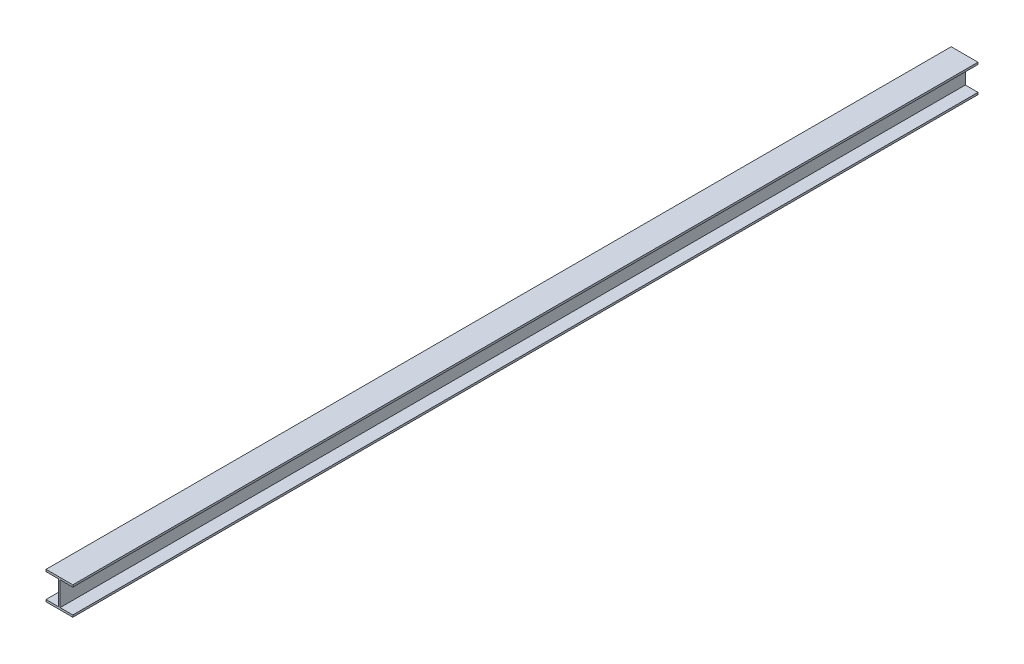
ISO-10303-21;
HEADER;
FILE_DESCRIPTION(('STEP AP214'),'2;1');
FILE_NAME('part.step','',(''),(''),'','','');
FILE_SCHEMA(('AUTOMOTIVE_DESIGN { 1 0 10303 214 1 1 1 1 }'));
ENDSEC;
DATA;
#1=APPLICATION_CONTEXT('core data for automotive mechanical design processes');
#2=APPLICATION_PROTOCOL_DEFINITION('international standard','automotive_design',2000,#1);
#3=PRODUCT_CONTEXT('',#1,'mechanical');
#4=PRODUCT('Part','Part','',(#3));
#5=PRODUCT_RELATED_PRODUCT_CATEGORY('part','',(#4));
#6=PRODUCT_DEFINITION_FORMATION('','',#4);
#7=PRODUCT_DEFINITION_CONTEXT('part definition',#1,'design');
#8=PRODUCT_DEFINITION('design','',#6,#7);
#9=PRODUCT_DEFINITION_SHAPE('','',#8);
#10=(LENGTH_UNIT() NAMED_UNIT(*) SI_UNIT(.MILLI.,.METRE.));
#11=(NAMED_UNIT(*) PLANE_ANGLE_UNIT() SI_UNIT($,.RADIAN.));
#12=(NAMED_UNIT(*) SI_UNIT($,.STERADIAN.) SOLID_ANGLE_UNIT());
#13=UNCERTAINTY_MEASURE_WITH_UNIT(LENGTH_MEASURE(1.E-05),#10,'distance_accuracy_value','');
#14=(GEOMETRIC_REPRESENTATION_CONTEXT(3) GLOBAL_UNCERTAINTY_ASSIGNED_CONTEXT((#13)) GLOBAL_UNIT_ASSIGNED_CONTEXT((#10,
#11,#12)) REPRESENTATION_CONTEXT('',''));
#15=CARTESIAN_POINT('',(0.,0.,0.));
#16=DIRECTION('',(0.,0.,1.));
#17=DIRECTION('',(1.,0.,0.));
#18=AXIS2_PLACEMENT_3D('',#15,#16,#17);
#19=CARTESIAN_POINT('',(154.432,-162.052240532958,5214.4));
#20=DIRECTION('',(0.,1.,0.));
#21=DIRECTION('',(-1.,0.,0.));
#22=AXIS2_PLACEMENT_3D('',#19,#20,#21);
#23=PLANE('',#22);
#24=DIRECTION('',(-1.,0.,0.));
#25=VECTOR('',#24,1.);
#26=CARTESIAN_POINT('',(154.432,-162.052240532958,2759.6));
#27=LINE('',#26,#25);
#28=CARTESIAN_POINT('',(154.432,-162.052240532958,2759.6));
#29=VERTEX_POINT('',#28);
#30=CARTESIAN_POINT('',(0.,-162.052240532958,2759.6));
#31=VERTEX_POINT('',#30);
#32=EDGE_CURVE('E11',#29,#31,#27,.T.);
#33=ORIENTED_EDGE('',*,*,#32,.F.);
#34=DIRECTION('',(0.,0.,-1.));
#35=VECTOR('',#34,1.);
#36=CARTESIAN_POINT('',(154.432,-162.052240532958,5214.4));
#37=LINE('',#36,#35);
#38=CARTESIAN_POINT('',(154.432,-162.052240532958,5214.4));
#39=VERTEX_POINT('',#38);
#40=EDGE_CURVE('E178',#39,#29,#37,.T.);
#41=ORIENTED_EDGE('',*,*,#40,.F.);
#42=DIRECTION('',(1.,0.,0.));
#43=VECTOR('',#42,1.);
#44=CARTESIAN_POINT('',(154.432,-162.052240532958,5214.4));
#45=LINE('',#44,#43);
#46=CARTESIAN_POINT('',(0.,-162.052240532958,5214.4));
#47=VERTEX_POINT('',#46);
#48=EDGE_CURVE('E235',#47,#39,#45,.T.);
#49=ORIENTED_EDGE('',*,*,#48,.F.);
#50=DIRECTION('',(0.,0.,-1.));
#51=VECTOR('',#50,1.);
#52=CARTESIAN_POINT('',(0.,-162.052240532958,5214.4));
#53=LINE('',#52,#51);
#54=EDGE_CURVE('E173',#47,#31,#53,.T.);
#55=ORIENTED_EDGE('',*,*,#54,.T.);
#56=EDGE_LOOP('',(#33,#41,#49,#55));
#57=FACE_BOUND('',#56,.T.);
#58=ADVANCED_FACE('F36',(#57),#23,.F.);
#59=DIRECTION('',(1.,0.,0.));
#60=VECTOR('',#59,1.);
#61=CARTESIAN_POINT('',(154.432,-162.052240532958,2454.8));
#62=LINE('',#61,#60);
#63=CARTESIAN_POINT('',(0.,-162.052240532958,2454.8));
#64=VERTEX_POINT('',#63);
#65=CARTESIAN_POINT('',(154.432,-162.052240532958,2454.8));
#66=VERTEX_POINT('',#65);
#67=EDGE_CURVE('E45',#64,#66,#62,.T.);
#68=ORIENTED_EDGE('',*,*,#67,.F.);
#69=CARTESIAN_POINT('',(0.,-162.052240532958,0.));
#70=VERTEX_POINT('',#69);
#71=EDGE_CURVE('E177',#64,#70,#53,.T.);
#72=ORIENTED_EDGE('',*,*,#71,.T.);
#73=DIRECTION('',(1.,0.,0.));
#74=VECTOR('',#73,1.);
#75=CARTESIAN_POINT('',(154.432,-162.052240532958,0.));
#76=LINE('',#75,#74);
#77=CARTESIAN_POINT('',(154.432,-162.052240532958,0.));
#78=VERTEX_POINT('',#77);
#79=EDGE_CURVE('E211',#70,#78,#76,.T.);
#80=ORIENTED_EDGE('',*,*,#79,.T.);
#81=EDGE_CURVE('E182',#66,#78,#37,.T.);
#82=ORIENTED_EDGE('',*,*,#81,.F.);
#83=EDGE_LOOP('',(#68,#72,#80,#82));
#84=FACE_BOUND('',#83,.T.);
#85=ADVANCED_FACE('F293',(#84),#23,.F.);
#86=CARTESIAN_POINT('',(0.,-11.5572405329582,5214.4));
#87=DIRECTION('',(1.,0.,0.));
#88=DIRECTION('',(0.,0.,-1.));
#89=AXIS2_PLACEMENT_3D('',#86,#87,#88);
#90=PLANE('',#89);
#91=DIRECTION('',(0.,-1.,0.));
#92=VECTOR('',#91,1.);
#93=CARTESIAN_POINT('',(0.,-11.5572405329582,0.));
#94=LINE('',#93,#92);
#95=CARTESIAN_POINT('',(0.,-0.000240532958150197,0.));
#96=VERTEX_POINT('',#95);
#97=CARTESIAN_POINT('',(0.,-11.5572405329582,0.));
#98=VERTEX_POINT('',#97);
#99=EDGE_CURVE('E162',#96,#98,#94,.T.);
#100=ORIENTED_EDGE('',*,*,#99,.T.);
#101=DIRECTION('',(0.,0.,-1.));
#102=VECTOR('',#101,1.);
#103=CARTESIAN_POINT('',(0.,-11.5572405329582,5214.4));
#104=LINE('',#103,#102);
#105=CARTESIAN_POINT('',(0.,-11.5572405329582,5214.4));
#106=VERTEX_POINT('',#105);
#107=EDGE_CURVE('E143',#106,#98,#104,.T.);
#108=ORIENTED_EDGE('',*,*,#107,.F.);
#109=DIRECTION('',(0.,-1.,0.));
#110=VECTOR('',#109,1.);
#111=CARTESIAN_POINT('',(0.,-11.5572405329582,5214.4));
#112=LINE('',#111,#110);
#113=CARTESIAN_POINT('',(0.,-0.000240532958150197,5214.4));
#114=VERTEX_POINT('',#113);
#115=EDGE_CURVE('E150',#114,#106,#112,.T.);
#116=ORIENTED_EDGE('',*,*,#115,.F.);
#117=DIRECTION('',(0.,0.,-1.));
#118=VECTOR('',#117,1.);
#119=CARTESIAN_POINT('',(0.,-0.000240532958150197,5214.4));
#120=LINE('',#119,#118);
#121=EDGE_CURVE('E198',#114,#96,#120,.T.);
#122=ORIENTED_EDGE('',*,*,#121,.T.);
#123=EDGE_LOOP('',(#100,#108,#116,#122));
#124=FACE_BOUND('',#123,.T.);
#125=ADVANCED_FACE('F38',(#124),#90,.F.);
#126=CARTESIAN_POINT('',(73.152,-11.5572405329581,5214.4));
#127=DIRECTION('',(0.,1.,0.));
#128=DIRECTION('',(-1.,0.,0.));
#129=AXIS2_PLACEMENT_3D('',#126,#127,#128);
#130=PLANE('',#129);
#131=DIRECTION('',(1.,0.,0.));
#132=VECTOR('',#131,1.);
#133=CARTESIAN_POINT('',(73.152,-11.5572405329581,0.));
#134=LINE('',#133,#132);
#135=CARTESIAN_POINT('',(73.152,-11.5572405329581,0.));
#136=VERTEX_POINT('',#135);
#137=EDGE_CURVE('E221',#98,#136,#134,.T.);
#138=ORIENTED_EDGE('',*,*,#137,.T.);
#139=DIRECTION('',(0.,0.,-1.));
#140=VECTOR('',#139,1.);
#141=CARTESIAN_POINT('',(73.152,-11.5572405329581,5214.4));
#142=LINE('',#141,#140);
#143=CARTESIAN_POINT('',(73.152,-11.5572405329581,5214.4));
#144=VERTEX_POINT('',#143);
#145=EDGE_CURVE('E146',#144,#136,#142,.T.);
#146=ORIENTED_EDGE('',*,*,#145,.F.);
#147=DIRECTION('',(1.,0.,0.));
#148=VECTOR('',#147,1.);
#149=CARTESIAN_POINT('',(73.152,-11.5572405329581,5214.4));
#150=LINE('',#149,#148);
#151=EDGE_CURVE('E139',#106,#144,#150,.T.);
#152=ORIENTED_EDGE('',*,*,#151,.F.);
#153=ORIENTED_EDGE('',*,*,#107,.T.);
#154=EDGE_LOOP('',(#138,#146,#152,#153));
#155=FACE_BOUND('',#154,.T.);
#156=ADVANCED_FACE('F141',(#155),#130,.F.);
#157=CARTESIAN_POINT('',(73.152,-150.495240532958,5214.4));
#158=DIRECTION('',(1.,0.,0.));
#159=DIRECTION('',(0.,0.,-1.));
#160=AXIS2_PLACEMENT_3D('',#157,#158,#159);
#161=PLANE('',#160);
#162=DIRECTION('',(0.,-1.,0.));
#163=VECTOR('',#162,1.);
#164=CARTESIAN_POINT('',(73.152,-150.495240532958,0.));
#165=LINE('',#164,#163);
#166=CARTESIAN_POINT('',(73.152,-150.495240532958,0.));
#167=VERTEX_POINT('',#166);
#168=EDGE_CURVE('E219',#136,#167,#165,.T.);
#169=ORIENTED_EDGE('',*,*,#168,.T.);
#170=DIRECTION('',(0.,0.,-1.));
#171=VECTOR('',#170,1.);
#172=CARTESIAN_POINT('',(73.152,-150.495240532958,5214.4));
#173=LINE('',#172,#171);
#174=CARTESIAN_POINT('',(73.152,-150.495240532958,5214.4));
#175=VERTEX_POINT('',#174);
#176=EDGE_CURVE('E165',#175,#167,#173,.T.);
#177=ORIENTED_EDGE('',*,*,#176,.F.);
#178=DIRECTION('',(0.,-1.,0.));
#179=VECTOR('',#178,1.);
#180=CARTESIAN_POINT('',(73.152,-150.495240532958,5214.4));
#181=LINE('',#180,#179);
#182=EDGE_CURVE('E149',#144,#175,#181,.T.);
#183=ORIENTED_EDGE('',*,*,#182,.F.);
#184=ORIENTED_EDGE('',*,*,#145,.T.);
#185=EDGE_LOOP('',(#169,#177,#183,#184));
#186=FACE_BOUND('',#185,.T.);
#187=ADVANCED_FACE('F245',(#186),#161,.F.);
#188=CARTESIAN_POINT('',(0.,-150.495240532958,5214.4));
#189=DIRECTION('',(0.,-1.,0.));
#190=DIRECTION('',(1.,0.,0.));
#191=AXIS2_PLACEMENT_3D('',#188,#189,#190);
#192=PLANE('',#191);
#193=DIRECTION('',(-1.,0.,0.));
#194=VECTOR('',#193,1.);
#195=CARTESIAN_POINT('',(0.,-150.495240532958,0.));
#196=LINE('',#195,#194);
#197=CARTESIAN_POINT('',(0.,-150.495240532958,0.));
#198=VERTEX_POINT('',#197);
#199=EDGE_CURVE('E217',#167,#198,#196,.T.);
#200=ORIENTED_EDGE('',*,*,#199,.T.);
#201=DIRECTION('',(0.,0.,-1.));
#202=VECTOR('',#201,1.);
#203=CARTESIAN_POINT('',(0.,-150.495240532958,5214.4));
#204=LINE('',#203,#202);
#205=CARTESIAN_POINT('',(0.,-150.495240532958,5214.4));
#206=VERTEX_POINT('',#205);
#207=EDGE_CURVE('E170',#206,#198,#204,.T.);
#208=ORIENTED_EDGE('',*,*,#207,.F.);
#209=DIRECTION('',(-1.,0.,0.));
#210=VECTOR('',#209,1.);
#211=CARTESIAN_POINT('',(0.,-150.495240532958,5214.4));
#212=LINE('',#211,#210);
#213=EDGE_CURVE('E239',#175,#206,#212,.T.);
#214=ORIENTED_EDGE('',*,*,#213,.F.);
#215=ORIENTED_EDGE('',*,*,#176,.T.);
#216=EDGE_LOOP('',(#200,#208,#214,#215));
#217=FACE_BOUND('',#216,.T.);
#218=ADVANCED_FACE('F249',(#217),#192,.F.);
#219=CARTESIAN_POINT('',(0.,-162.052240532958,5214.4));
#220=DIRECTION('',(1.,0.,0.));
#221=DIRECTION('',(0.,1.,0.));
#222=AXIS2_PLACEMENT_3D('',#219,#220,#221);
#223=PLANE('',#222);
#224=DIRECTION('',(0.,-1.,0.));
#225=VECTOR('',#224,1.);
#226=CARTESIAN_POINT('',(0.,-162.052240532958,0.));
#227=LINE('',#226,#225);
#228=EDGE_CURVE('E214',#198,#70,#227,.T.);
#229=ORIENTED_EDGE('',*,*,#228,.T.);
#230=ORIENTED_EDGE('',*,*,#71,.F.);
#231=EDGE_CURVE('E176',#31,#64,#53,.T.);
#232=ORIENTED_EDGE('',*,*,#231,.F.);
#233=ORIENTED_EDGE('',*,*,#54,.F.);
#234=DIRECTION('',(0.,-1.,0.));
#235=VECTOR('',#234,1.);
#236=CARTESIAN_POINT('',(0.,-162.052240532958,5214.4));
#237=LINE('',#236,#235);
#238=EDGE_CURVE('E237',#206,#47,#237,.T.);
#239=ORIENTED_EDGE('',*,*,#238,.F.);
#240=ORIENTED_EDGE('',*,*,#207,.T.);
#241=EDGE_LOOP('',(#229,#230,#232,#233,#239,#240));
#242=FACE_BOUND('',#241,.T.);
#243=ADVANCED_FACE('F254',(#242),#223,.F.);
#244=CARTESIAN_POINT('',(154.432,-162.052240532958,2607.2));
#245=VERTEX_POINT('',#244);
#246=EDGE_CURVE('E181',#29,#245,#37,.T.);
#247=ORIENTED_EDGE('',*,*,#246,.F.);
#248=ORIENTED_EDGE('',*,*,#32,.T.);
#249=ORIENTED_EDGE('',*,*,#231,.T.);
#250=ORIENTED_EDGE('',*,*,#67,.T.);
#251=EDGE_CURVE('E292',#245,#66,#37,.T.);
#252=ORIENTED_EDGE('',*,*,#251,.F.);
#253=EDGE_LOOP('',(#247,#248,#249,#250,#252));
#254=FACE_BOUND('',#253,.T.);
#255=ADVANCED_FACE('F290',(#254),#23,.F.);
#256=CARTESIAN_POINT('',(154.432,-150.495240532958,5214.4));
#257=DIRECTION('',(-1.,0.,0.));
#258=DIRECTION('',(0.,0.,1.));
#259=AXIS2_PLACEMENT_3D('',#256,#257,#258);
#260=PLANE('',#259);
#261=DIRECTION('',(0.,1.,0.));
#262=VECTOR('',#261,1.);
#263=CARTESIAN_POINT('',(154.432,-150.495240532958,0.));
#264=LINE('',#263,#262);
#265=CARTESIAN_POINT('',(154.432,-150.495240532958,0.));
#266=VERTEX_POINT('',#265);
#267=EDGE_CURVE('E209',#78,#266,#264,.T.);
#268=ORIENTED_EDGE('',*,*,#267,.T.);
#269=DIRECTION('',(0.,0.,-1.));
#270=VECTOR('',#269,1.);
#271=CARTESIAN_POINT('',(154.432,-150.495240532958,5214.4));
#272=LINE('',#271,#270);
#273=CARTESIAN_POINT('',(154.432,-150.495240532958,5214.4));
#274=VERTEX_POINT('',#273);
#275=EDGE_CURVE('E183',#274,#266,#272,.T.);
#276=ORIENTED_EDGE('',*,*,#275,.F.);
#277=DIRECTION('',(0.,1.,0.));
#278=VECTOR('',#277,1.);
#279=CARTESIAN_POINT('',(154.432,-150.495240532958,5214.4));
#280=LINE('',#279,#278);
#281=EDGE_CURVE('E233',#39,#274,#280,.T.);
#282=ORIENTED_EDGE('',*,*,#281,.F.);
#283=ORIENTED_EDGE('',*,*,#40,.T.);
#284=ORIENTED_EDGE('',*,*,#246,.T.);
#285=ORIENTED_EDGE('',*,*,#251,.T.);
#286=ORIENTED_EDGE('',*,*,#81,.T.);
#287=EDGE_LOOP('',(#268,#276,#282,#283,#284,#285,#286));
#288=FACE_BOUND('',#287,.T.);
#289=ADVANCED_FACE('F262',(#288),#260,.F.);
#290=CARTESIAN_POINT('',(81.28,-150.495240532958,5214.4));
#291=DIRECTION('',(0.,-1.,0.));
#292=DIRECTION('',(1.,0.,0.));
#293=AXIS2_PLACEMENT_3D('',#290,#291,#292);
#294=PLANE('',#293);
#295=DIRECTION('',(-1.,0.,0.));
#296=VECTOR('',#295,1.);
#297=CARTESIAN_POINT('',(81.28,-150.495240532958,0.));
#298=LINE('',#297,#296);
#299=CARTESIAN_POINT('',(81.28,-150.495240532958,0.));
#300=VERTEX_POINT('',#299);
#301=EDGE_CURVE('E207',#266,#300,#298,.T.);
#302=ORIENTED_EDGE('',*,*,#301,.T.);
#303=DIRECTION('',(0.,0.,-1.));
#304=VECTOR('',#303,1.);
#305=CARTESIAN_POINT('',(81.28,-150.495240532958,5214.4));
#306=LINE('',#305,#304);
#307=CARTESIAN_POINT('',(81.28,-150.495240532958,5214.4));
#308=VERTEX_POINT('',#307);
#309=EDGE_CURVE('E186',#308,#300,#306,.T.);
#310=ORIENTED_EDGE('',*,*,#309,.F.);
#311=DIRECTION('',(-1.,0.,0.));
#312=VECTOR('',#311,1.);
#313=CARTESIAN_POINT('',(81.28,-150.495240532958,5214.4));
#314=LINE('',#313,#312);
#315=EDGE_CURVE('E231',#274,#308,#314,.T.);
#316=ORIENTED_EDGE('',*,*,#315,.F.);
#317=ORIENTED_EDGE('',*,*,#275,.T.);
#318=EDGE_LOOP('',(#302,#310,#316,#317));
#319=FACE_BOUND('',#318,.T.);
#320=ADVANCED_FACE('F268',(#319),#294,.F.);
#321=CARTESIAN_POINT('',(81.28,-11.5572405329582,5214.4));
#322=DIRECTION('',(-1.,0.,0.));
#323=DIRECTION('',(0.,-1.,0.));
#324=AXIS2_PLACEMENT_3D('',#321,#322,#323);
#325=PLANE('',#324);
#326=DIRECTION('',(0.,1.,0.));
#327=VECTOR('',#326,1.);
#328=CARTESIAN_POINT('',(81.28,-11.5572405329582,0.));
#329=LINE('',#328,#327);
#330=CARTESIAN_POINT('',(81.28,-11.5572405329582,0.));
#331=VERTEX_POINT('',#330);
#332=EDGE_CURVE('E205',#300,#331,#329,.T.);
#333=ORIENTED_EDGE('',*,*,#332,.T.);
#334=DIRECTION('',(0.,0.,-1.));
#335=VECTOR('',#334,1.);
#336=CARTESIAN_POINT('',(81.28,-11.5572405329582,5214.4));
#337=LINE('',#336,#335);
#338=CARTESIAN_POINT('',(81.28,-11.5572405329582,5214.4));
#339=VERTEX_POINT('',#338);
#340=EDGE_CURVE('E189',#339,#331,#337,.T.);
#341=ORIENTED_EDGE('',*,*,#340,.F.);
#342=DIRECTION('',(0.,1.,0.));
#343=VECTOR('',#342,1.);
#344=CARTESIAN_POINT('',(81.28,-11.5572405329582,5214.4));
#345=LINE('',#344,#343);
#346=EDGE_CURVE('E229',#308,#339,#345,.T.);
#347=ORIENTED_EDGE('',*,*,#346,.F.);
#348=ORIENTED_EDGE('',*,*,#309,.T.);
#349=EDGE_LOOP('',(#333,#341,#347,#348));
#350=FACE_BOUND('',#349,.T.);
#351=ADVANCED_FACE('F274',(#350),#325,.F.);
#352=CARTESIAN_POINT('',(154.432,-11.5572405329581,5214.4));
#353=DIRECTION('',(0.,1.,0.));
#354=DIRECTION('',(-1.,0.,0.));
#355=AXIS2_PLACEMENT_3D('',#352,#353,#354);
#356=PLANE('',#355);
#357=DIRECTION('',(1.,0.,0.));
#358=VECTOR('',#357,1.);
#359=CARTESIAN_POINT('',(154.432,-11.5572405329581,0.));
#360=LINE('',#359,#358);
#361=CARTESIAN_POINT('',(154.432,-11.5572405329581,0.));
#362=VERTEX_POINT('',#361);
#363=EDGE_CURVE('E203',#331,#362,#360,.T.);
#364=ORIENTED_EDGE('',*,*,#363,.T.);
#365=DIRECTION('',(0.,0.,-1.));
#366=VECTOR('',#365,1.);
#367=CARTESIAN_POINT('',(154.432,-11.5572405329581,5214.4));
#368=LINE('',#367,#366);
#369=CARTESIAN_POINT('',(154.432,-11.5572405329581,5214.4));
#370=VERTEX_POINT('',#369);
#371=EDGE_CURVE('E192',#370,#362,#368,.T.);
#372=ORIENTED_EDGE('',*,*,#371,.F.);
#373=DIRECTION('',(1.,0.,0.));
#374=VECTOR('',#373,1.);
#375=CARTESIAN_POINT('',(154.432,-11.5572405329581,5214.4));
#376=LINE('',#375,#374);
#377=EDGE_CURVE('E227',#339,#370,#376,.T.);
#378=ORIENTED_EDGE('',*,*,#377,.F.);
#379=ORIENTED_EDGE('',*,*,#340,.T.);
#380=EDGE_LOOP('',(#364,#372,#378,#379));
#381=FACE_BOUND('',#380,.T.);
#382=ADVANCED_FACE('F278',(#381),#356,.F.);
#383=CARTESIAN_POINT('',(154.432,-0.000240532958131285,5214.4));
#384=DIRECTION('',(-1.,0.,0.));
#385=DIRECTION('',(0.,0.,1.));
#386=AXIS2_PLACEMENT_3D('',#383,#384,#385);
#387=PLANE('',#386);
#388=DIRECTION('',(0.,1.,0.));
#389=VECTOR('',#388,1.);
#390=CARTESIAN_POINT('',(154.432,-0.000240532958131285,0.));
#391=LINE('',#390,#389);
#392=CARTESIAN_POINT('',(154.432,-0.000240532958131285,0.));
#393=VERTEX_POINT('',#392);
#394=EDGE_CURVE('E201',#362,#393,#391,.T.);
#395=ORIENTED_EDGE('',*,*,#394,.T.);
#396=DIRECTION('',(0.,0.,-1.));
#397=VECTOR('',#396,1.);
#398=CARTESIAN_POINT('',(154.432,-0.000240532958131285,5214.4));
#399=LINE('',#398,#397);
#400=CARTESIAN_POINT('',(154.432,-0.000240532958131285,5214.4));
#401=VERTEX_POINT('',#400);
#402=EDGE_CURVE('E195',#401,#393,#399,.T.);
#403=ORIENTED_EDGE('',*,*,#402,.F.);
#404=DIRECTION('',(0.,1.,0.));
#405=VECTOR('',#404,1.);
#406=CARTESIAN_POINT('',(154.432,-0.000240532958131285,5214.4));
#407=LINE('',#406,#405);
#408=EDGE_CURVE('E225',#370,#401,#407,.T.);
#409=ORIENTED_EDGE('',*,*,#408,.F.);
#410=ORIENTED_EDGE('',*,*,#371,.T.);
#411=EDGE_LOOP('',(#395,#403,#409,#410));
#412=FACE_BOUND('',#411,.T.);
#413=ADVANCED_FACE('F283',(#412),#387,.F.);
#414=CARTESIAN_POINT('',(0.,-0.000240532958150197,5214.4));
#415=DIRECTION('',(0.,-1.,0.));
#416=DIRECTION('',(1.,0.,0.));
#417=AXIS2_PLACEMENT_3D('',#414,#415,#416);
#418=PLANE('',#417);
#419=DIRECTION('',(-1.,0.,0.));
#420=VECTOR('',#419,1.);
#421=CARTESIAN_POINT('',(0.,-0.000240532958150197,0.));
#422=LINE('',#421,#420);
#423=EDGE_CURVE('E159',#393,#96,#422,.T.);
#424=ORIENTED_EDGE('',*,*,#423,.T.);
#425=ORIENTED_EDGE('',*,*,#121,.F.);
#426=DIRECTION('',(-1.,0.,0.));
#427=VECTOR('',#426,1.);
#428=CARTESIAN_POINT('',(0.,-0.000240532958150197,5214.4));
#429=LINE('',#428,#427);
#430=EDGE_CURVE('E155',#401,#114,#429,.T.);
#431=ORIENTED_EDGE('',*,*,#430,.F.);
#432=ORIENTED_EDGE('',*,*,#402,.T.);
#433=EDGE_LOOP('',(#424,#425,#431,#432));
#434=FACE_BOUND('',#433,.T.);
#435=ADVANCED_FACE('F286',(#434),#418,.F.);
#436=CARTESIAN_POINT('',(0.,0.,5214.4));
#437=DIRECTION('',(0.,0.,-1.));
#438=DIRECTION('',(-1.,0.,0.));
#439=AXIS2_PLACEMENT_3D('',#436,#437,#438);
#440=PLANE('',#439);
#441=ORIENTED_EDGE('',*,*,#115,.T.);
#442=ORIENTED_EDGE('',*,*,#151,.T.);
#443=ORIENTED_EDGE('',*,*,#182,.T.);
#444=ORIENTED_EDGE('',*,*,#213,.T.);
#445=ORIENTED_EDGE('',*,*,#238,.T.);
#446=ORIENTED_EDGE('',*,*,#48,.T.);
#447=ORIENTED_EDGE('',*,*,#281,.T.);
#448=ORIENTED_EDGE('',*,*,#315,.T.);
#449=ORIENTED_EDGE('',*,*,#346,.T.);
#450=ORIENTED_EDGE('',*,*,#377,.T.);
#451=ORIENTED_EDGE('',*,*,#408,.T.);
#452=ORIENTED_EDGE('',*,*,#430,.T.);
#453=EDGE_LOOP('',(#441,#442,#443,#444,#445,#446,#447,#448,#449,#450,#451,#452));
#454=FACE_BOUND('',#453,.T.);
#455=ADVANCED_FACE('F153',(#454),#440,.F.);
#456=CARTESIAN_POINT('',(0.,0.,0.));
#457=DIRECTION('',(0.,0.,-1.));
#458=DIRECTION('',(-1.,0.,0.));
#459=AXIS2_PLACEMENT_3D('',#456,#457,#458);
#460=PLANE('',#459);
#461=ORIENTED_EDGE('',*,*,#99,.F.);
#462=ORIENTED_EDGE('',*,*,#423,.F.);
#463=ORIENTED_EDGE('',*,*,#394,.F.);
#464=ORIENTED_EDGE('',*,*,#363,.F.);
#465=ORIENTED_EDGE('',*,*,#332,.F.);
#466=ORIENTED_EDGE('',*,*,#301,.F.);
#467=ORIENTED_EDGE('',*,*,#267,.F.);
#468=ORIENTED_EDGE('',*,*,#79,.F.);
#469=ORIENTED_EDGE('',*,*,#228,.F.);
#470=ORIENTED_EDGE('',*,*,#199,.F.);
#471=ORIENTED_EDGE('',*,*,#168,.F.);
#472=ORIENTED_EDGE('',*,*,#137,.F.);
#473=EDGE_LOOP('',(#461,#462,#463,#464,#465,#466,#467,#468,#469,#470,#471,#472));
#474=FACE_BOUND('',#473,.T.);
#475=ADVANCED_FACE('F288',(#474),#460,.T.);
#476=CLOSED_SHELL('',(#58,#85,#125,#156,#187,#218,#243,#255,#289,#320,#351,#382,#413,#435,#455,#475));
#477=MANIFOLD_SOLID_BREP('B2',#476);
#478=ADVANCED_BREP_SHAPE_REPRESENTATION('',(#18,#477),#14);
#479=SHAPE_DEFINITION_REPRESENTATION(#9,#478);
ENDSEC;
END-ISO-10303-21;
